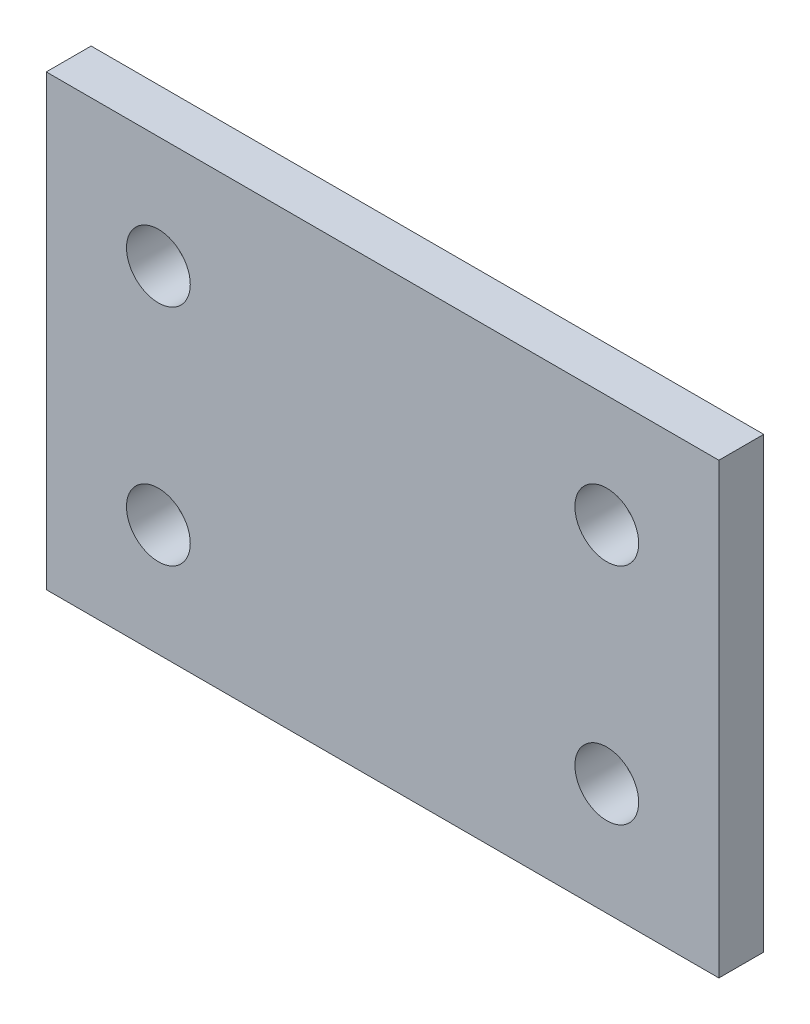
ISO-10303-21;
HEADER;
FILE_DESCRIPTION(('STEP AP214'),'2;1');
FILE_NAME('part.step','',(''),(''),'','','');
FILE_SCHEMA(('AUTOMOTIVE_DESIGN { 1 0 10303 214 1 1 1 1 }'));
ENDSEC;
DATA;
#1=APPLICATION_CONTEXT('core data for automotive mechanical design processes');
#2=APPLICATION_PROTOCOL_DEFINITION('international standard','automotive_design',2000,#1);
#3=PRODUCT_CONTEXT('',#1,'mechanical');
#4=PRODUCT('Part','Part','',(#3));
#5=PRODUCT_RELATED_PRODUCT_CATEGORY('part','',(#4));
#6=PRODUCT_DEFINITION_FORMATION('','',#4);
#7=PRODUCT_DEFINITION_CONTEXT('part definition',#1,'design');
#8=PRODUCT_DEFINITION('design','',#6,#7);
#9=PRODUCT_DEFINITION_SHAPE('','',#8);
#10=(LENGTH_UNIT() NAMED_UNIT(*) SI_UNIT(.MILLI.,.METRE.));
#11=(NAMED_UNIT(*) PLANE_ANGLE_UNIT() SI_UNIT($,.RADIAN.));
#12=(NAMED_UNIT(*) SI_UNIT($,.STERADIAN.) SOLID_ANGLE_UNIT());
#13=UNCERTAINTY_MEASURE_WITH_UNIT(LENGTH_MEASURE(1.E-05),#10,'distance_accuracy_value','');
#14=(GEOMETRIC_REPRESENTATION_CONTEXT(3) GLOBAL_UNCERTAINTY_ASSIGNED_CONTEXT((#13)) GLOBAL_UNIT_ASSIGNED_CONTEXT((#10,
#11,#12)) REPRESENTATION_CONTEXT('',''));
#15=CARTESIAN_POINT('',(0.,0.,0.));
#16=DIRECTION('',(0.,0.,1.));
#17=DIRECTION('',(1.,0.,0.));
#18=AXIS2_PLACEMENT_3D('',#15,#16,#17);
#19=CARTESIAN_POINT('',(15.,-10.,2.));
#20=DIRECTION('',(-1.,0.,0.));
#21=DIRECTION('',(0.,0.,1.));
#22=AXIS2_PLACEMENT_3D('',#19,#20,#21);
#23=PLANE('',#22);
#24=DIRECTION('',(0.,1.,0.));
#25=VECTOR('',#24,1.);
#26=CARTESIAN_POINT('',(15.,-10.,0.));
#27=LINE('',#26,#25);
#28=CARTESIAN_POINT('',(15.,-10.,0.));
#29=VERTEX_POINT('',#28);
#30=CARTESIAN_POINT('',(15.,10.,0.));
#31=VERTEX_POINT('',#30);
#32=EDGE_CURVE('E96',#29,#31,#27,.T.);
#33=ORIENTED_EDGE('',*,*,#32,.T.);
#34=DIRECTION('',(0.,0.,-1.));
#35=VECTOR('',#34,1.);
#36=CARTESIAN_POINT('',(15.,10.,2.));
#37=LINE('',#36,#35);
#38=CARTESIAN_POINT('',(15.,10.,2.));
#39=VERTEX_POINT('',#38);
#40=EDGE_CURVE('E11',#39,#31,#37,.T.);
#41=ORIENTED_EDGE('',*,*,#40,.F.);
#42=DIRECTION('',(0.,1.,0.));
#43=VECTOR('',#42,1.);
#44=CARTESIAN_POINT('',(15.,-10.,2.));
#45=LINE('',#44,#43);
#46=CARTESIAN_POINT('',(15.,-10.,2.));
#47=VERTEX_POINT('',#46);
#48=EDGE_CURVE('E84',#47,#39,#45,.T.);
#49=ORIENTED_EDGE('',*,*,#48,.F.);
#50=DIRECTION('',(0.,0.,-1.));
#51=VECTOR('',#50,1.);
#52=CARTESIAN_POINT('',(15.,-10.,2.));
#53=LINE('',#52,#51);
#54=EDGE_CURVE('E92',#47,#29,#53,.T.);
#55=ORIENTED_EDGE('',*,*,#54,.T.);
#56=EDGE_LOOP('',(#33,#41,#49,#55));
#57=FACE_BOUND('',#56,.T.);
#58=ADVANCED_FACE('F33',(#57),#23,.F.);
#59=CARTESIAN_POINT('',(-15.,10.,2.));
#60=DIRECTION('',(0.,-1.,0.));
#61=DIRECTION('',(0.,0.,-1.));
#62=AXIS2_PLACEMENT_3D('',#59,#60,#61);
#63=PLANE('',#62);
#64=DIRECTION('',(-1.,0.,0.));
#65=VECTOR('',#64,1.);
#66=CARTESIAN_POINT('',(-15.,10.,0.));
#67=LINE('',#66,#65);
#68=CARTESIAN_POINT('',(-15.,10.,0.));
#69=VERTEX_POINT('',#68);
#70=EDGE_CURVE('E88',#31,#69,#67,.T.);
#71=ORIENTED_EDGE('',*,*,#70,.T.);
#72=DIRECTION('',(0.,0.,-1.));
#73=VECTOR('',#72,1.);
#74=CARTESIAN_POINT('',(-15.,10.,2.));
#75=LINE('',#74,#73);
#76=CARTESIAN_POINT('',(-15.,10.,2.));
#77=VERTEX_POINT('',#76);
#78=EDGE_CURVE('E41',#77,#69,#75,.T.);
#79=ORIENTED_EDGE('',*,*,#78,.F.);
#80=DIRECTION('',(-1.,0.,0.));
#81=VECTOR('',#80,1.);
#82=CARTESIAN_POINT('',(-15.,10.,2.));
#83=LINE('',#82,#81);
#84=EDGE_CURVE('E79',#39,#77,#83,.T.);
#85=ORIENTED_EDGE('',*,*,#84,.F.);
#86=ORIENTED_EDGE('',*,*,#40,.T.);
#87=EDGE_LOOP('',(#71,#79,#85,#86));
#88=FACE_BOUND('',#87,.T.);
#89=ADVANCED_FACE('F87',(#88),#63,.F.);
#90=CARTESIAN_POINT('',(-15.,-10.,2.));
#91=DIRECTION('',(1.,0.,0.));
#92=DIRECTION('',(0.,0.,-1.));
#93=AXIS2_PLACEMENT_3D('',#90,#91,#92);
#94=PLANE('',#93);
#95=DIRECTION('',(0.,-1.,0.));
#96=VECTOR('',#95,1.);
#97=CARTESIAN_POINT('',(-15.,-10.,0.));
#98=LINE('',#97,#96);
#99=CARTESIAN_POINT('',(-15.,-10.,0.));
#100=VERTEX_POINT('',#99);
#101=EDGE_CURVE('E66',#69,#100,#98,.T.);
#102=ORIENTED_EDGE('',*,*,#101,.T.);
#103=DIRECTION('',(0.,0.,-1.));
#104=VECTOR('',#103,1.);
#105=CARTESIAN_POINT('',(-15.,-10.,2.));
#106=LINE('',#105,#104);
#107=CARTESIAN_POINT('',(-15.,-10.,2.));
#108=VERTEX_POINT('',#107);
#109=EDGE_CURVE('E89',#108,#100,#106,.T.);
#110=ORIENTED_EDGE('',*,*,#109,.F.);
#111=DIRECTION('',(0.,-1.,0.));
#112=VECTOR('',#111,1.);
#113=CARTESIAN_POINT('',(-15.,-10.,2.));
#114=LINE('',#113,#112);
#115=EDGE_CURVE('E82',#77,#108,#114,.T.);
#116=ORIENTED_EDGE('',*,*,#115,.F.);
#117=ORIENTED_EDGE('',*,*,#78,.T.);
#118=EDGE_LOOP('',(#102,#110,#116,#117));
#119=FACE_BOUND('',#118,.T.);
#120=ADVANCED_FACE('F90',(#119),#94,.F.);
#121=CARTESIAN_POINT('',(-15.,-10.,2.));
#122=DIRECTION('',(0.,1.,0.));
#123=DIRECTION('',(0.,0.,1.));
#124=AXIS2_PLACEMENT_3D('',#121,#122,#123);
#125=PLANE('',#124);
#126=DIRECTION('',(1.,0.,0.));
#127=VECTOR('',#126,1.);
#128=CARTESIAN_POINT('',(-15.,-10.,0.));
#129=LINE('',#128,#127);
#130=EDGE_CURVE('E72',#100,#29,#129,.T.);
#131=ORIENTED_EDGE('',*,*,#130,.T.);
#132=ORIENTED_EDGE('',*,*,#54,.F.);
#133=DIRECTION('',(1.,0.,0.));
#134=VECTOR('',#133,1.);
#135=CARTESIAN_POINT('',(-15.,-10.,2.));
#136=LINE('',#135,#134);
#137=EDGE_CURVE('E49',#108,#47,#136,.T.);
#138=ORIENTED_EDGE('',*,*,#137,.F.);
#139=ORIENTED_EDGE('',*,*,#109,.T.);
#140=EDGE_LOOP('',(#131,#132,#138,#139));
#141=FACE_BOUND('',#140,.T.);
#142=ADVANCED_FACE('F104',(#141),#125,.F.);
#143=CARTESIAN_POINT('',(0.,0.,2.));
#144=DIRECTION('',(0.,0.,-1.));
#145=DIRECTION('',(-1.,0.,0.));
#146=AXIS2_PLACEMENT_3D('',#143,#144,#145);
#147=PLANE('',#146);
#148=CARTESIAN_POINT('',(10.0000000000001,-5.,2.));
#149=DIRECTION('',(0.,0.,1.));
#150=DIRECTION('',(1.,0.,0.));
#151=AXIS2_PLACEMENT_3D('',#148,#149,#150);
#152=CIRCLE('',#151,1.42240000000001);
#153=CARTESIAN_POINT('',(11.4224000000001,-5.,2.));
#154=VERTEX_POINT('',#153);
#155=EDGE_CURVE('E119',#154,#154,#152,.T.);
#156=ORIENTED_EDGE('',*,*,#155,.F.);
#157=EDGE_LOOP('',(#156));
#158=FACE_BOUND('',#157,.T.);
#159=CARTESIAN_POINT('',(-9.9999999999999,-5.00000000000014,2.));
#160=DIRECTION('',(0.,0.,1.));
#161=DIRECTION('',(1.,0.,0.));
#162=AXIS2_PLACEMENT_3D('',#159,#160,#161);
#163=CIRCLE('',#162,1.42240000000001);
#164=CARTESIAN_POINT('',(-8.57759999999989,-5.00000000000014,2.));
#165=VERTEX_POINT('',#164);
#166=EDGE_CURVE('E125',#165,#165,#163,.T.);
#167=ORIENTED_EDGE('',*,*,#166,.F.);
#168=EDGE_LOOP('',(#167));
#169=FACE_BOUND('',#168,.T.);
#170=CARTESIAN_POINT('',(-10.,4.99999999999986,2.));
#171=DIRECTION('',(0.,0.,1.));
#172=DIRECTION('',(1.,0.,0.));
#173=AXIS2_PLACEMENT_3D('',#170,#171,#172);
#174=CIRCLE('',#173,1.42240000000001);
#175=CARTESIAN_POINT('',(-8.5776,4.99999999999986,2.));
#176=VERTEX_POINT('',#175);
#177=EDGE_CURVE('E113',#176,#176,#174,.T.);
#178=ORIENTED_EDGE('',*,*,#177,.F.);
#179=EDGE_LOOP('',(#178));
#180=FACE_BOUND('',#179,.T.);
#181=CARTESIAN_POINT('',(9.99999999999999,5.,2.));
#182=DIRECTION('',(0.,0.,1.));
#183=DIRECTION('',(1.,0.,0.));
#184=AXIS2_PLACEMENT_3D('',#181,#182,#183);
#185=CIRCLE('',#184,1.42240000000001);
#186=CARTESIAN_POINT('',(11.4224,5.,2.));
#187=VERTEX_POINT('',#186);
#188=EDGE_CURVE('E99',#187,#187,#185,.T.);
#189=ORIENTED_EDGE('',*,*,#188,.F.);
#190=EDGE_LOOP('',(#189));
#191=FACE_BOUND('',#190,.T.);
#192=ORIENTED_EDGE('',*,*,#48,.T.);
#193=ORIENTED_EDGE('',*,*,#84,.T.);
#194=ORIENTED_EDGE('',*,*,#115,.T.);
#195=ORIENTED_EDGE('',*,*,#137,.T.);
#196=EDGE_LOOP('',(#192,#193,#194,#195));
#197=FACE_BOUND('',#196,.T.);
#198=ADVANCED_FACE('F80',(#158,#169,#180,#191,#197),#147,.F.);
#199=CARTESIAN_POINT('',(0.,0.,0.));
#200=DIRECTION('',(0.,0.,-1.));
#201=DIRECTION('',(-1.,0.,0.));
#202=AXIS2_PLACEMENT_3D('',#199,#200,#201);
#203=PLANE('',#202);
#204=CARTESIAN_POINT('',(10.0000000000001,-5.,0.));
#205=DIRECTION('',(0.,0.,-1.));
#206=DIRECTION('',(-1.,0.,0.));
#207=AXIS2_PLACEMENT_3D('',#204,#205,#206);
#208=CIRCLE('',#207,1.42240000000001);
#209=CARTESIAN_POINT('',(8.57760000000009,-5.,0.));
#210=VERTEX_POINT('',#209);
#211=EDGE_CURVE('E116',#210,#210,#208,.F.);
#212=ORIENTED_EDGE('',*,*,#211,.T.);
#213=EDGE_LOOP('',(#212));
#214=FACE_BOUND('',#213,.T.);
#215=CARTESIAN_POINT('',(-9.9999999999999,-5.00000000000014,0.));
#216=DIRECTION('',(0.,0.,-1.));
#217=DIRECTION('',(-1.,0.,0.));
#218=AXIS2_PLACEMENT_3D('',#215,#216,#217);
#219=CIRCLE('',#218,1.42240000000001);
#220=CARTESIAN_POINT('',(-11.4223999999999,-5.00000000000014,0.));
#221=VERTEX_POINT('',#220);
#222=EDGE_CURVE('E122',#221,#221,#219,.F.);
#223=ORIENTED_EDGE('',*,*,#222,.T.);
#224=EDGE_LOOP('',(#223));
#225=FACE_BOUND('',#224,.T.);
#226=CARTESIAN_POINT('',(-10.,4.99999999999986,0.));
#227=DIRECTION('',(0.,0.,-1.));
#228=DIRECTION('',(-1.,0.,0.));
#229=AXIS2_PLACEMENT_3D('',#226,#227,#228);
#230=CIRCLE('',#229,1.42240000000001);
#231=CARTESIAN_POINT('',(-11.4224,4.99999999999986,0.));
#232=VERTEX_POINT('',#231);
#233=EDGE_CURVE('E128',#232,#232,#230,.F.);
#234=ORIENTED_EDGE('',*,*,#233,.T.);
#235=EDGE_LOOP('',(#234));
#236=FACE_BOUND('',#235,.T.);
#237=CARTESIAN_POINT('',(9.99999999999999,5.,0.));
#238=DIRECTION('',(0.,0.,-1.));
#239=DIRECTION('',(-1.,0.,0.));
#240=AXIS2_PLACEMENT_3D('',#237,#238,#239);
#241=CIRCLE('',#240,1.42240000000001);
#242=CARTESIAN_POINT('',(8.57759999999999,5.,0.));
#243=VERTEX_POINT('',#242);
#244=EDGE_CURVE('E110',#243,#243,#241,.F.);
#245=ORIENTED_EDGE('',*,*,#244,.T.);
#246=EDGE_LOOP('',(#245));
#247=FACE_BOUND('',#246,.T.);
#248=ORIENTED_EDGE('',*,*,#32,.F.);
#249=ORIENTED_EDGE('',*,*,#130,.F.);
#250=ORIENTED_EDGE('',*,*,#101,.F.);
#251=ORIENTED_EDGE('',*,*,#70,.F.);
#252=EDGE_LOOP('',(#248,#249,#250,#251));
#253=FACE_BOUND('',#252,.T.);
#254=ADVANCED_FACE('F107',(#214,#225,#236,#247,#253),#203,.T.);
#255=CARTESIAN_POINT('',(9.99999999999999,5.,-0.00100000000000013));
#256=DIRECTION('',(0.,0.,1.));
#257=DIRECTION('',(1.,0.,0.));
#258=AXIS2_PLACEMENT_3D('',#255,#256,#257);
#259=CYLINDRICAL_SURFACE('',#258,1.42240000000001);
#260=ORIENTED_EDGE('',*,*,#244,.F.);
#261=EDGE_LOOP('',(#260));
#262=FACE_BOUND('',#261,.T.);
#263=ORIENTED_EDGE('',*,*,#188,.T.);
#264=EDGE_LOOP('',(#263));
#265=FACE_BOUND('',#264,.T.);
#266=ADVANCED_FACE('F142',(#262,#265),#259,.F.);
#267=CARTESIAN_POINT('',(-10.,4.99999999999986,-0.00100000000000013));
#268=DIRECTION('',(0.,0.,1.));
#269=DIRECTION('',(1.,0.,0.));
#270=AXIS2_PLACEMENT_3D('',#267,#268,#269);
#271=CYLINDRICAL_SURFACE('',#270,1.42240000000001);
#272=ORIENTED_EDGE('',*,*,#233,.F.);
#273=EDGE_LOOP('',(#272));
#274=FACE_BOUND('',#273,.T.);
#275=ORIENTED_EDGE('',*,*,#177,.T.);
#276=EDGE_LOOP('',(#275));
#277=FACE_BOUND('',#276,.T.);
#278=ADVANCED_FACE('F134',(#274,#277),#271,.F.);
#279=CARTESIAN_POINT('',(-9.9999999999999,-5.00000000000014,-0.00100000000000013));
#280=DIRECTION('',(0.,0.,1.));
#281=DIRECTION('',(1.,0.,0.));
#282=AXIS2_PLACEMENT_3D('',#279,#280,#281);
#283=CYLINDRICAL_SURFACE('',#282,1.42240000000001);
#284=ORIENTED_EDGE('',*,*,#222,.F.);
#285=EDGE_LOOP('',(#284));
#286=FACE_BOUND('',#285,.T.);
#287=ORIENTED_EDGE('',*,*,#166,.T.);
#288=EDGE_LOOP('',(#287));
#289=FACE_BOUND('',#288,.T.);
#290=ADVANCED_FACE('F150',(#286,#289),#283,.F.);
#291=CARTESIAN_POINT('',(10.0000000000001,-5.,-0.00100000000000013));
#292=DIRECTION('',(0.,0.,1.));
#293=DIRECTION('',(1.,0.,0.));
#294=AXIS2_PLACEMENT_3D('',#291,#292,#293);
#295=CYLINDRICAL_SURFACE('',#294,1.42240000000001);
#296=ORIENTED_EDGE('',*,*,#211,.F.);
#297=EDGE_LOOP('',(#296));
#298=FACE_BOUND('',#297,.T.);
#299=ORIENTED_EDGE('',*,*,#155,.T.);
#300=EDGE_LOOP('',(#299));
#301=FACE_BOUND('',#300,.T.);
#302=ADVANCED_FACE('F198',(#298,#301),#295,.F.);
#303=CLOSED_SHELL('',(#58,#89,#120,#142,#198,#254,#266,#278,#290,#302));
#304=MANIFOLD_SOLID_BREP('B2',#303);
#305=ADVANCED_BREP_SHAPE_REPRESENTATION('',(#18,#304),#14);
#306=SHAPE_DEFINITION_REPRESENTATION(#9,#305);
ENDSEC;
END-ISO-10303-21;
